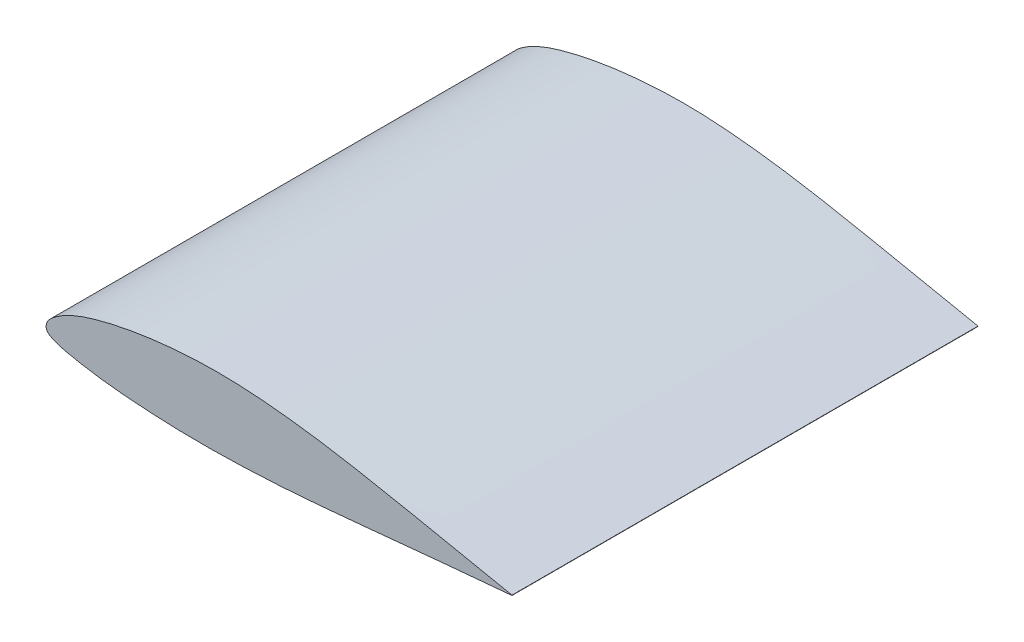
ISO-10303-21;
HEADER;
FILE_DESCRIPTION(('STEP AP214'),'2;1');
FILE_NAME('part.step','',(''),(''),'','','');
FILE_SCHEMA(('AUTOMOTIVE_DESIGN { 1 0 10303 214 1 1 1 1 }'));
ENDSEC;
DATA;
#1=APPLICATION_CONTEXT('core data for automotive mechanical design processes');
#2=APPLICATION_PROTOCOL_DEFINITION('international standard','automotive_design',2000,#1);
#3=PRODUCT_CONTEXT('',#1,'mechanical');
#4=PRODUCT('Part','Part','',(#3));
#5=PRODUCT_RELATED_PRODUCT_CATEGORY('part','',(#4));
#6=PRODUCT_DEFINITION_FORMATION('','',#4);
#7=PRODUCT_DEFINITION_CONTEXT('part definition',#1,'design');
#8=PRODUCT_DEFINITION('design','',#6,#7);
#9=PRODUCT_DEFINITION_SHAPE('','',#8);
#10=(LENGTH_UNIT() NAMED_UNIT(*) SI_UNIT(.MILLI.,.METRE.));
#11=(NAMED_UNIT(*) PLANE_ANGLE_UNIT() SI_UNIT($,.RADIAN.));
#12=(NAMED_UNIT(*) SI_UNIT($,.STERADIAN.) SOLID_ANGLE_UNIT());
#13=UNCERTAINTY_MEASURE_WITH_UNIT(LENGTH_MEASURE(1.E-05),#10,'distance_accuracy_value','');
#14=(GEOMETRIC_REPRESENTATION_CONTEXT(3) GLOBAL_UNCERTAINTY_ASSIGNED_CONTEXT((#13)) GLOBAL_UNIT_ASSIGNED_CONTEXT((#10,
#11,#12)) REPRESENTATION_CONTEXT('',''));
#15=CARTESIAN_POINT('',(0.,0.,0.));
#16=DIRECTION('',(0.,0.,1.));
#17=DIRECTION('',(1.,0.,0.));
#18=AXIS2_PLACEMENT_3D('',#15,#16,#17);
#19=CARTESIAN_POINT('',(1225.19695059447,43.5812285203719,1397.27563878957));
#20=CARTESIAN_POINT('',(1220.96361588443,44.4490588615043,1397.27563878957));
#21=CARTESIAN_POINT('',(1212.49694646434,46.1847195437692,1397.27563878957));
#22=CARTESIAN_POINT('',(1199.79779799736,48.7880940926785,1397.27563878957));
#23=CARTESIAN_POINT('',(1187.10201393037,51.3905432703636,1397.27563878957));
#24=CARTESIAN_POINT('',(1174.39495608914,53.9200411249562,1397.27563878957));
#25=CARTESIAN_POINT('',(1161.70745614369,56.5028873572944,1397.27563878957));
#26=CARTESIAN_POINT('',(1149.00674671135,58.949910133063,1397.27563878957));
#27=CARTESIAN_POINT('',(1136.31676239849,61.3127386289865,1397.27563878957));
#28=CARTESIAN_POINT('',(1123.61790073753,63.4290100376665,1397.27563878957));
#29=CARTESIAN_POINT('',(1110.91970640156,65.2803947416039,1397.27563878957));
#30=CARTESIAN_POINT('',(1098.21515387573,66.7644673731914,1397.27563878957));
#31=CARTESIAN_POINT('',(1085.51398401253,67.9128309021185,1397.27563878957));
#32=CARTESIAN_POINT('',(1072.80528588002,68.5762181670409,1397.27563878957));
#33=CARTESIAN_POINT('',(1060.09216435831,68.6657170639936,1397.27563878957));
#34=CARTESIAN_POINT('',(1047.37817784439,68.1632689305675,1397.27563878957));
#35=CARTESIAN_POINT('',(1034.66516752411,67.0594580518907,1397.27563878957));
#36=CARTESIAN_POINT('',(1021.9457450494,65.3788705419111,1397.27563878957));
#37=CARTESIAN_POINT('',(1009.20749182446,63.0400653432608,1397.27563878957));
#38=CARTESIAN_POINT('',(998.630362729331,60.3803377725643,1397.27563878957));
#39=CARTESIAN_POINT('',(990.143931112278,57.7116756690205,1397.27563878957));
#40=CARTESIAN_POINT('',(983.724511815478,55.0167179518837,1397.27563878957));
#41=CARTESIAN_POINT('',(978.38701118717,52.0904155309607,1397.27563878957));
#42=CARTESIAN_POINT('',(974.898903030756,49.4604882861454,1397.27563878957));
#43=CARTESIAN_POINT('',(973.248583385999,47.8970168823892,1397.27563878957));
#44=CARTESIAN_POINT('',(972.423314857456,46.8622252551725,1397.27563878957));
#45=CARTESIAN_POINT('',(971.53255225883,45.5600050491304,1397.27563878957));
#46=CARTESIAN_POINT('',(971.332465403073,44.3317923276388,1397.27563878957));
#47=CARTESIAN_POINT('',(971.196950594469,43.4999485203719,1397.27563878957));
#48=B_SPLINE_CURVE_WITH_KNOTS('',3,(#19,#20,#21,#22,#23,#24,#25,#26,#27,#28,#29,#30,#31,#32,#33,
#34,#35,#36,#37,#38,#39,#40,#41,#42,#43,#44,#45,#46,#47),.UNSPECIFIED.,.F.,.F.,(4,1,1,1,1,1,1,1,
1,1,1,1,1,1,1,1,1,1,1,1,1,1,1,1,1,1,4),(0.,0.0493090029177142,0.0986180058354286,
0.147917330788828,0.197185991735426,0.24645655553437,0.295656092832776,0.344771435422364,
0.393740070281271,0.442545529926078,0.491180600667711,0.539673423487364,0.58804065372872,
0.63634622161305,0.684688532428688,0.733172943700227,0.781902750731639,0.831035667747521,
0.880869217806444,0.906257515286788,0.932464732755104,0.960212511506556,0.975439067521417,
0.982209146152901,0.986056558537096,0.990556387155134,1.),.UNSPECIFIED.);
#49=DIRECTION('',(0.,0.,-1.));
#50=VECTOR('',#49,1.);
#51=SURFACE_OF_LINEAR_EXTRUSION('',#48,#50);
#52=CARTESIAN_POINT('',(1225.19695059447,43.5812285203719,1143.27563878957));
#53=CARTESIAN_POINT('',(1220.96361588443,44.4490588615043,1143.27563878957));
#54=CARTESIAN_POINT('',(1212.49694646434,46.1847195437692,1143.27563878957));
#55=CARTESIAN_POINT('',(1199.79779799736,48.7880940926785,1143.27563878957));
#56=CARTESIAN_POINT('',(1187.10201393037,51.3905432703636,1143.27563878957));
#57=CARTESIAN_POINT('',(1174.39495608914,53.9200411249562,1143.27563878957));
#58=CARTESIAN_POINT('',(1161.70745614369,56.5028873572944,1143.27563878957));
#59=CARTESIAN_POINT('',(1149.00674671135,58.949910133063,1143.27563878957));
#60=CARTESIAN_POINT('',(1136.31676239849,61.3127386289865,1143.27563878957));
#61=CARTESIAN_POINT('',(1123.61790073753,63.4290100376665,1143.27563878957));
#62=CARTESIAN_POINT('',(1110.91970640156,65.2803947416039,1143.27563878957));
#63=CARTESIAN_POINT('',(1098.21515387573,66.7644673731914,1143.27563878957));
#64=CARTESIAN_POINT('',(1085.51398401253,67.9128309021185,1143.27563878957));
#65=CARTESIAN_POINT('',(1072.80528588002,68.5762181670409,1143.27563878957));
#66=CARTESIAN_POINT('',(1060.09216435831,68.6657170639936,1143.27563878957));
#67=CARTESIAN_POINT('',(1047.37817784439,68.1632689305675,1143.27563878957));
#68=CARTESIAN_POINT('',(1034.66516752411,67.0594580518907,1143.27563878957));
#69=CARTESIAN_POINT('',(1021.9457450494,65.3788705419111,1143.27563878957));
#70=CARTESIAN_POINT('',(1009.20749182446,63.0400653432608,1143.27563878957));
#71=CARTESIAN_POINT('',(998.630362729331,60.3803377725643,1143.27563878957));
#72=CARTESIAN_POINT('',(990.143931112278,57.7116756690205,1143.27563878957));
#73=CARTESIAN_POINT('',(983.724511815478,55.0167179518837,1143.27563878957));
#74=CARTESIAN_POINT('',(978.38701118717,52.0904155309607,1143.27563878957));
#75=CARTESIAN_POINT('',(974.898903030756,49.4604882861454,1143.27563878957));
#76=CARTESIAN_POINT('',(973.248583385999,47.8970168823892,1143.27563878957));
#77=CARTESIAN_POINT('',(972.423314857456,46.8622252551725,1143.27563878957));
#78=CARTESIAN_POINT('',(971.53255225883,45.5600050491304,1143.27563878957));
#79=CARTESIAN_POINT('',(971.332465403073,44.3317923276388,1143.27563878957));
#80=CARTESIAN_POINT('',(971.196950594469,43.4999485203719,1143.27563878957));
#81=B_SPLINE_CURVE_WITH_KNOTS('',3,(#52,#53,#54,#55,#56,#57,#58,#59,#60,#61,#62,#63,#64,#65,#66,
#67,#68,#69,#70,#71,#72,#73,#74,#75,#76,#77,#78,#79,#80),.UNSPECIFIED.,.F.,.F.,(4,1,1,1,1,1,1,1,
1,1,1,1,1,1,1,1,1,1,1,1,1,1,1,1,1,1,4),(0.,0.0493090029177142,0.0986180058354286,
0.147917330788828,0.197185991735426,0.24645655553437,0.295656092832776,0.344771435422364,
0.393740070281271,0.442545529926078,0.491180600667711,0.539673423487364,0.58804065372872,
0.63634622161305,0.684688532428688,0.733172943700227,0.781902750731639,0.831035667747521,
0.880869217806444,0.906257515286788,0.932464732755104,0.960212511506556,0.975439067521417,
0.982209146152901,0.986056558537096,0.990556387155134,1.),.UNSPECIFIED.);
#82=CARTESIAN_POINT('',(1225.19695059447,43.5812285203719,1143.27563878957));
#83=VERTEX_POINT('',#82);
#84=CARTESIAN_POINT('',(971.196950594469,43.4999485203719,1143.27563878957));
#85=VERTEX_POINT('',#84);
#86=EDGE_CURVE('E83',#83,#85,#81,.T.);
#87=ORIENTED_EDGE('',*,*,#86,.T.);
#88=DIRECTION('',(0.,0.,-1.));
#89=VECTOR('',#88,1.);
#90=CARTESIAN_POINT('',(971.196950594469,43.4999485203719,1397.27563878957));
#91=LINE('',#90,#89);
#92=CARTESIAN_POINT('',(971.196950594469,43.4999485203719,1397.27563878957));
#93=VERTEX_POINT('',#92);
#94=EDGE_CURVE('E11',#93,#85,#91,.T.);
#95=ORIENTED_EDGE('',*,*,#94,.F.);
#96=CARTESIAN_POINT('',(1225.19695059447,43.5812285203719,1397.27563878957));
#97=VERTEX_POINT('',#96);
#98=EDGE_CURVE('E77',#97,#93,#48,.T.);
#99=ORIENTED_EDGE('',*,*,#98,.F.);
#100=DIRECTION('',(0.,0.,-1.));
#101=VECTOR('',#100,1.);
#102=CARTESIAN_POINT('',(1225.19695059447,43.5812285203719,1397.27563878957));
#103=LINE('',#102,#101);
#104=EDGE_CURVE('E84',#97,#83,#103,.T.);
#105=ORIENTED_EDGE('',*,*,#104,.T.);
#106=EDGE_LOOP('',(#87,#95,#99,#105));
#107=FACE_BOUND('',#106,.T.);
#108=ADVANCED_FACE('F36',(#107),#51,.F.);
#109=CARTESIAN_POINT('',(971.196950594469,43.4999485203719,1397.27563878957));
#110=CARTESIAN_POINT('',(971.314936054479,42.768074635385,1397.27563878957));
#111=CARTESIAN_POINT('',(971.483711790985,41.7211443275486,1397.27563878957));
#112=CARTESIAN_POINT('',(972.417624124904,40.7944676281097,1397.27563878957));
#113=CARTESIAN_POINT('',(973.290754733385,40.1947011606051,1397.27563878957));
#114=CARTESIAN_POINT('',(974.913601205262,39.1986319526554,1397.27563878957));
#115=CARTESIAN_POINT('',(978.524546163529,37.8651742003841,1397.27563878957));
#116=CARTESIAN_POINT('',(983.845744463528,36.5148095429968,1397.27563878957));
#117=CARTESIAN_POINT('',(990.23838039718,35.3729857768456,1397.27563878957));
#118=CARTESIAN_POINT('',(998.67938371862,33.9095301364586,1397.27563878957));
#119=CARTESIAN_POINT('',(1009.27369535298,32.6612300654915,1397.27563878957));
#120=CARTESIAN_POINT('',(1021.98390642,31.592427433589,1397.27563878957));
#121=CARTESIAN_POINT('',(1034.6903216628,30.8952785413762,1397.27563878957));
#122=CARTESIAN_POINT('',(1047.39394706892,30.4967426240854,1397.27563878957));
#123=CARTESIAN_POINT('',(1060.09796622571,30.439547722439,1397.27563878957));
#124=CARTESIAN_POINT('',(1072.80037068717,30.6703157136616,1397.27563878957));
#125=CARTESIAN_POINT('',(1085.50189530826,31.1460533557082,1397.27563878957));
#126=CARTESIAN_POINT('',(1098.20395668661,31.8325621397535,1397.27563878957));
#127=CARTESIAN_POINT('',(1110.90209985367,32.7570891871467,1397.27563878957));
#128=CARTESIAN_POINT('',(1123.6028056095,33.7980778128966,1397.27563878957));
#129=CARTESIAN_POINT('',(1136.29993849438,34.9886552051871,1397.27563878957));
#130=CARTESIAN_POINT('',(1148.99989067868,36.2254513122012,1397.27563878957));
#131=CARTESIAN_POINT('',(1161.69174994278,37.5542575545085,1397.27563878957));
#132=CARTESIAN_POINT('',(1174.39770825782,38.726294695838,1397.27563878957));
#133=CARTESIAN_POINT('',(1187.09482926284,39.9496132934088,1397.27563878957));
#134=CARTESIAN_POINT('',(1199.79653208006,41.1077002527216,1397.27563878957));
#135=CARTESIAN_POINT('',(1212.49695918493,42.2628518522543,1397.27563878957));
#136=CARTESIAN_POINT('',(1220.96362012462,43.033396297666,1397.27563878957));
#137=CARTESIAN_POINT('',(1225.19695059447,43.4186685203719,1397.27563878957));
#138=B_SPLINE_CURVE_WITH_KNOTS('',3,(#109,#110,#111,#112,#113,#114,#115,#116,#117,#118,#119,
#120,#121,#122,#123,#124,#125,#126,#127,#128,#129,#130,#131,#132,#133,#134,#135,#136,#137),
.UNSPECIFIED.,.F.,.F.,(4,1,1,1,1,1,1,1,1,1,1,1,1,1,1,1,1,1,1,1,1,1,1,1,1,1,4),(0.,
0.00831287761105129,0.0118913978143936,0.0149294470722404,0.0206849683554117,0.0339989326472162,
0.0595085441503255,0.0846044311622384,0.109604751981845,0.159294455351743,0.208781057583043,
0.258167390207649,0.307500399280571,0.356810692017488,0.40612795457633,0.455471321546785,
0.50485385618875,0.554288310357294,0.603765053504628,0.653284729071318,0.702830574164404,
0.752393051751023,0.80192468772923,0.851455391996832,0.900973256705168,0.950486628352584,1.),.UNSPECIFIED.);
#139=DIRECTION('',(0.,0.,-1.));
#140=VECTOR('',#139,1.);
#141=SURFACE_OF_LINEAR_EXTRUSION('',#138,#140);
#142=CARTESIAN_POINT('',(971.196950594469,43.4999485203719,1143.27563878957));
#143=CARTESIAN_POINT('',(971.314936054479,42.768074635385,1143.27563878957));
#144=CARTESIAN_POINT('',(971.483711790985,41.7211443275486,1143.27563878957));
#145=CARTESIAN_POINT('',(972.417624124904,40.7944676281097,1143.27563878957));
#146=CARTESIAN_POINT('',(973.290754733385,40.1947011606051,1143.27563878957));
#147=CARTESIAN_POINT('',(974.913601205262,39.1986319526554,1143.27563878957));
#148=CARTESIAN_POINT('',(978.524546163529,37.8651742003841,1143.27563878957));
#149=CARTESIAN_POINT('',(983.845744463528,36.5148095429968,1143.27563878957));
#150=CARTESIAN_POINT('',(990.23838039718,35.3729857768456,1143.27563878957));
#151=CARTESIAN_POINT('',(998.67938371862,33.9095301364586,1143.27563878957));
#152=CARTESIAN_POINT('',(1009.27369535298,32.6612300654915,1143.27563878957));
#153=CARTESIAN_POINT('',(1021.98390642,31.592427433589,1143.27563878957));
#154=CARTESIAN_POINT('',(1034.6903216628,30.8952785413762,1143.27563878957));
#155=CARTESIAN_POINT('',(1047.39394706892,30.4967426240854,1143.27563878957));
#156=CARTESIAN_POINT('',(1060.09796622571,30.439547722439,1143.27563878957));
#157=CARTESIAN_POINT('',(1072.80037068717,30.6703157136616,1143.27563878957));
#158=CARTESIAN_POINT('',(1085.50189530826,31.1460533557082,1143.27563878957));
#159=CARTESIAN_POINT('',(1098.20395668661,31.8325621397535,1143.27563878957));
#160=CARTESIAN_POINT('',(1110.90209985367,32.7570891871467,1143.27563878957));
#161=CARTESIAN_POINT('',(1123.6028056095,33.7980778128966,1143.27563878957));
#162=CARTESIAN_POINT('',(1136.29993849438,34.9886552051871,1143.27563878957));
#163=CARTESIAN_POINT('',(1148.99989067868,36.2254513122012,1143.27563878957));
#164=CARTESIAN_POINT('',(1161.69174994278,37.5542575545085,1143.27563878957));
#165=CARTESIAN_POINT('',(1174.39770825782,38.726294695838,1143.27563878957));
#166=CARTESIAN_POINT('',(1187.09482926284,39.9496132934088,1143.27563878957));
#167=CARTESIAN_POINT('',(1199.79653208006,41.1077002527216,1143.27563878957));
#168=CARTESIAN_POINT('',(1212.49695918493,42.2628518522543,1143.27563878957));
#169=CARTESIAN_POINT('',(1220.96362012462,43.033396297666,1143.27563878957));
#170=CARTESIAN_POINT('',(1225.19695059447,43.4186685203719,1143.27563878957));
#171=B_SPLINE_CURVE_WITH_KNOTS('',3,(#142,#143,#144,#145,#146,#147,#148,#149,#150,#151,#152,
#153,#154,#155,#156,#157,#158,#159,#160,#161,#162,#163,#164,#165,#166,#167,#168,#169,#170),
.UNSPECIFIED.,.F.,.F.,(4,1,1,1,1,1,1,1,1,1,1,1,1,1,1,1,1,1,1,1,1,1,1,1,1,1,4),(0.,
0.00831287761105129,0.0118913978143936,0.0149294470722404,0.0206849683554117,0.0339989326472162,
0.0595085441503255,0.0846044311622384,0.109604751981845,0.159294455351743,0.208781057583043,
0.258167390207649,0.307500399280571,0.356810692017488,0.40612795457633,0.455471321546785,
0.50485385618875,0.554288310357294,0.603765053504628,0.653284729071318,0.702830574164404,
0.752393051751023,0.80192468772923,0.851455391996832,0.900973256705168,0.950486628352584,1.),.UNSPECIFIED.);
#172=CARTESIAN_POINT('',(1225.19695059447,43.4186685203719,1143.27563878957));
#173=VERTEX_POINT('',#172);
#174=EDGE_CURVE('E65',#85,#173,#171,.T.);
#175=ORIENTED_EDGE('',*,*,#174,.T.);
#176=DIRECTION('',(0.,0.,-1.));
#177=VECTOR('',#176,1.);
#178=CARTESIAN_POINT('',(1225.19695059447,43.4186685203719,1397.27563878957));
#179=LINE('',#178,#177);
#180=CARTESIAN_POINT('',(1225.19695059447,43.4186685203719,1397.27563878957));
#181=VERTEX_POINT('',#180);
#182=EDGE_CURVE('E45',#181,#173,#179,.T.);
#183=ORIENTED_EDGE('',*,*,#182,.F.);
#184=EDGE_CURVE('E73',#93,#181,#138,.T.);
#185=ORIENTED_EDGE('',*,*,#184,.F.);
#186=ORIENTED_EDGE('',*,*,#94,.T.);
#187=EDGE_LOOP('',(#175,#183,#185,#186));
#188=FACE_BOUND('',#187,.T.);
#189=ADVANCED_FACE('F74',(#188),#141,.F.);
#190=CARTESIAN_POINT('',(1225.19695059447,43.5812285203719,1397.27563878957));
#191=DIRECTION('',(-1.,0.,0.));
#192=DIRECTION('',(0.,0.,1.));
#193=AXIS2_PLACEMENT_3D('',#190,#191,#192);
#194=PLANE('',#193);
#195=DIRECTION('',(0.,1.,0.));
#196=VECTOR('',#195,1.);
#197=CARTESIAN_POINT('',(1225.19695059447,43.5812285203719,1143.27563878957));
#198=LINE('',#197,#196);
#199=EDGE_CURVE('E70',#173,#83,#198,.T.);
#200=ORIENTED_EDGE('',*,*,#199,.T.);
#201=ORIENTED_EDGE('',*,*,#104,.F.);
#202=DIRECTION('',(0.,1.,0.));
#203=VECTOR('',#202,1.);
#204=CARTESIAN_POINT('',(1225.19695059447,43.5812285203719,1397.27563878957));
#205=LINE('',#204,#203);
#206=EDGE_CURVE('E53',#181,#97,#205,.T.);
#207=ORIENTED_EDGE('',*,*,#206,.F.);
#208=ORIENTED_EDGE('',*,*,#182,.T.);
#209=EDGE_LOOP('',(#200,#201,#207,#208));
#210=FACE_BOUND('',#209,.T.);
#211=ADVANCED_FACE('F101',(#210),#194,.F.);
#212=CARTESIAN_POINT('',(1095.88983159457,66.9437491924644,1397.27563878957));
#213=DIRECTION('',(0.,0.,1.));
#214=DIRECTION('',(1.,0.,0.));
#215=AXIS2_PLACEMENT_3D('',#212,#213,#214);
#216=PLANE('',#215);
#217=ORIENTED_EDGE('',*,*,#98,.T.);
#218=ORIENTED_EDGE('',*,*,#184,.T.);
#219=ORIENTED_EDGE('',*,*,#206,.T.);
#220=EDGE_LOOP('',(#217,#218,#219));
#221=FACE_BOUND('',#220,.T.);
#222=ADVANCED_FACE('F80',(#221),#216,.T.);
#223=CARTESIAN_POINT('',(1095.88983159457,66.9437491924644,1143.27563878957));
#224=DIRECTION('',(0.,0.,1.));
#225=DIRECTION('',(1.,0.,0.));
#226=AXIS2_PLACEMENT_3D('',#223,#224,#225);
#227=PLANE('',#226);
#228=ORIENTED_EDGE('',*,*,#86,.F.);
#229=ORIENTED_EDGE('',*,*,#199,.F.);
#230=ORIENTED_EDGE('',*,*,#174,.F.);
#231=EDGE_LOOP('',(#228,#229,#230));
#232=FACE_BOUND('',#231,.T.);
#233=ADVANCED_FACE('F102',(#232),#227,.F.);
#234=CLOSED_SHELL('',(#108,#189,#211,#222,#233));
#235=MANIFOLD_SOLID_BREP('B2',#234);
#236=ADVANCED_BREP_SHAPE_REPRESENTATION('',(#18,#235),#14);
#237=SHAPE_DEFINITION_REPRESENTATION(#9,#236);
ENDSEC;
END-ISO-10303-21;
